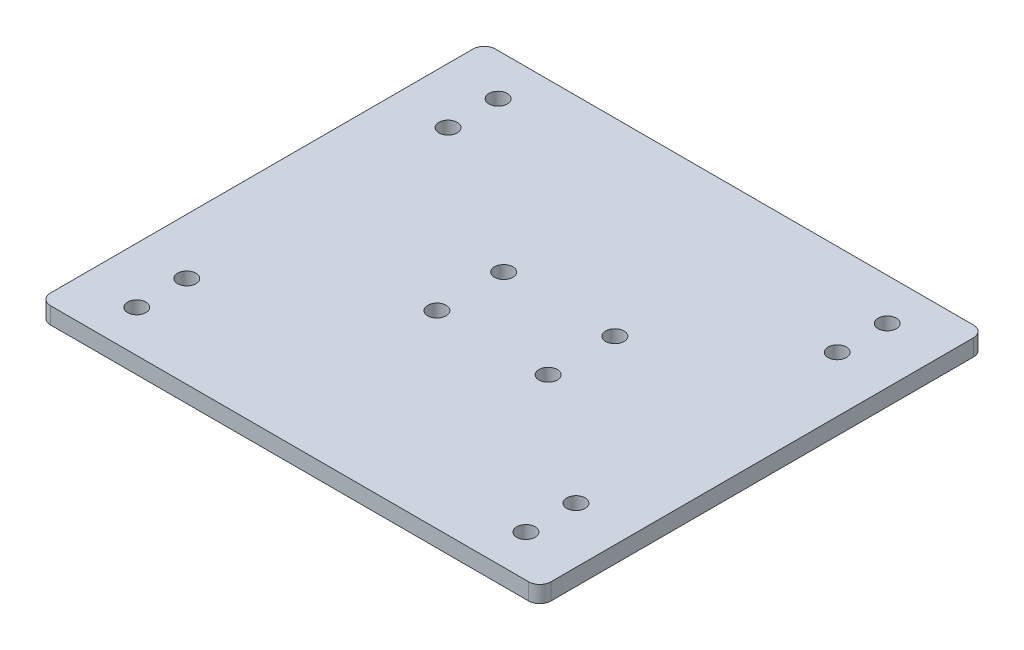
ISO-10303-21;
HEADER;
FILE_DESCRIPTION(('STEP AP214'),'2;1');
FILE_NAME('part.step','',(''),(''),'','','');
FILE_SCHEMA(('AUTOMOTIVE_DESIGN { 1 0 10303 214 1 1 1 1 }'));
ENDSEC;
DATA;
#1=APPLICATION_CONTEXT('core data for automotive mechanical design processes');
#2=APPLICATION_PROTOCOL_DEFINITION('international standard','automotive_design',2000,#1);
#3=PRODUCT_CONTEXT('',#1,'mechanical');
#4=PRODUCT('Part','Part','',(#3));
#5=PRODUCT_RELATED_PRODUCT_CATEGORY('part','',(#4));
#6=PRODUCT_DEFINITION_FORMATION('','',#4);
#7=PRODUCT_DEFINITION_CONTEXT('part definition',#1,'design');
#8=PRODUCT_DEFINITION('design','',#6,#7);
#9=PRODUCT_DEFINITION_SHAPE('','',#8);
#10=(LENGTH_UNIT() NAMED_UNIT(*) SI_UNIT(.MILLI.,.METRE.));
#11=(NAMED_UNIT(*) PLANE_ANGLE_UNIT() SI_UNIT($,.RADIAN.));
#12=(NAMED_UNIT(*) SI_UNIT($,.STERADIAN.) SOLID_ANGLE_UNIT());
#13=UNCERTAINTY_MEASURE_WITH_UNIT(LENGTH_MEASURE(1.E-05),#10,'distance_accuracy_value','');
#14=(GEOMETRIC_REPRESENTATION_CONTEXT(3) GLOBAL_UNCERTAINTY_ASSIGNED_CONTEXT((#13)) GLOBAL_UNIT_ASSIGNED_CONTEXT((#10,
#11,#12)) REPRESENTATION_CONTEXT('',''));
#15=CARTESIAN_POINT('',(0.,0.,0.));
#16=DIRECTION('',(0.,0.,1.));
#17=DIRECTION('',(1.,0.,0.));
#18=AXIS2_PLACEMENT_3D('',#15,#16,#17);
#19=CARTESIAN_POINT('',(45.,1.5,40.));
#20=DIRECTION('',(-1.,0.,0.));
#21=DIRECTION('',(0.,0.,1.));
#22=AXIS2_PLACEMENT_3D('',#19,#20,#21);
#23=PLANE('',#22);
#24=DIRECTION('',(0.,0.,-1.));
#25=VECTOR('',#24,1.);
#26=CARTESIAN_POINT('',(45.,-1.5,40.));
#27=LINE('',#26,#25);
#28=CARTESIAN_POINT('',(45.,-1.5,38.));
#29=VERTEX_POINT('',#28);
#30=CARTESIAN_POINT('',(45.,-1.5,-38.));
#31=VERTEX_POINT('',#30);
#32=EDGE_CURVE('E144',#29,#31,#27,.T.);
#33=ORIENTED_EDGE('',*,*,#32,.T.);
#34=DIRECTION('',(0.,-1.,0.));
#35=VECTOR('',#34,1.);
#36=CARTESIAN_POINT('',(45.,1.5,-38.));
#37=LINE('',#36,#35);
#38=CARTESIAN_POINT('',(45.,1.5,-38.));
#39=VERTEX_POINT('',#38);
#40=EDGE_CURVE('E177',#31,#39,#37,.F.);
#41=ORIENTED_EDGE('',*,*,#40,.T.);
#42=DIRECTION('',(0.,0.,-1.));
#43=VECTOR('',#42,1.);
#44=CARTESIAN_POINT('',(45.,1.5,40.));
#45=LINE('',#44,#43);
#46=CARTESIAN_POINT('',(45.,1.5,38.));
#47=VERTEX_POINT('',#46);
#48=EDGE_CURVE('E141',#47,#39,#45,.T.);
#49=ORIENTED_EDGE('',*,*,#48,.F.);
#50=DIRECTION('',(0.,-1.,0.));
#51=VECTOR('',#50,1.);
#52=CARTESIAN_POINT('',(45.,1.5,38.));
#53=LINE('',#52,#51);
#54=EDGE_CURVE('E172',#47,#29,#53,.T.);
#55=ORIENTED_EDGE('',*,*,#54,.T.);
#56=EDGE_LOOP('',(#33,#41,#49,#55));
#57=FACE_BOUND('',#56,.T.);
#58=ADVANCED_FACE('F42',(#57),#23,.F.);
#59=CARTESIAN_POINT('',(-45.,1.5,-40.));
#60=DIRECTION('',(0.,0.,1.));
#61=DIRECTION('',(1.,0.,0.));
#62=AXIS2_PLACEMENT_3D('',#59,#60,#61);
#63=PLANE('',#62);
#64=DIRECTION('',(-1.,0.,0.));
#65=VECTOR('',#64,1.);
#66=CARTESIAN_POINT('',(-45.,-1.5,-40.));
#67=LINE('',#66,#65);
#68=CARTESIAN_POINT('',(43.,-1.5,-40.));
#69=VERTEX_POINT('',#68);
#70=CARTESIAN_POINT('',(-43.,-1.5,-40.));
#71=VERTEX_POINT('',#70);
#72=EDGE_CURVE('E137',#69,#71,#67,.T.);
#73=ORIENTED_EDGE('',*,*,#72,.T.);
#74=DIRECTION('',(0.,-1.,0.));
#75=VECTOR('',#74,1.);
#76=CARTESIAN_POINT('',(-43.,1.5,-40.));
#77=LINE('',#76,#75);
#78=CARTESIAN_POINT('',(-43.,1.5,-40.));
#79=VERTEX_POINT('',#78);
#80=EDGE_CURVE('E113',#71,#79,#77,.F.);
#81=ORIENTED_EDGE('',*,*,#80,.T.);
#82=DIRECTION('',(-1.,0.,0.));
#83=VECTOR('',#82,1.);
#84=CARTESIAN_POINT('',(-45.,1.5,-40.));
#85=LINE('',#84,#83);
#86=CARTESIAN_POINT('',(43.,1.5,-40.));
#87=VERTEX_POINT('',#86);
#88=EDGE_CURVE('E196',#87,#79,#85,.T.);
#89=ORIENTED_EDGE('',*,*,#88,.F.);
#90=DIRECTION('',(0.,-1.,0.));
#91=VECTOR('',#90,1.);
#92=CARTESIAN_POINT('',(43.,1.5,-40.));
#93=LINE('',#92,#91);
#94=EDGE_CURVE('E123',#87,#69,#93,.T.);
#95=ORIENTED_EDGE('',*,*,#94,.T.);
#96=EDGE_LOOP('',(#73,#81,#89,#95));
#97=FACE_BOUND('',#96,.T.);
#98=ADVANCED_FACE('F346',(#97),#63,.F.);
#99=CARTESIAN_POINT('',(-45.,1.5,40.));
#100=DIRECTION('',(1.,0.,0.));
#101=DIRECTION('',(0.,0.,-1.));
#102=AXIS2_PLACEMENT_3D('',#99,#100,#101);
#103=PLANE('',#102);
#104=DIRECTION('',(0.,0.,1.));
#105=VECTOR('',#104,1.);
#106=CARTESIAN_POINT('',(-45.,1.5,40.));
#107=LINE('',#106,#105);
#108=CARTESIAN_POINT('',(-45.,1.5,-38.));
#109=VERTEX_POINT('',#108);
#110=CARTESIAN_POINT('',(-45.,1.5,38.));
#111=VERTEX_POINT('',#110);
#112=EDGE_CURVE('E128',#109,#111,#107,.T.);
#113=ORIENTED_EDGE('',*,*,#112,.F.);
#114=DIRECTION('',(0.,-1.,0.));
#115=VECTOR('',#114,1.);
#116=CARTESIAN_POINT('',(-45.,1.5,-38.));
#117=LINE('',#116,#115);
#118=CARTESIAN_POINT('',(-45.,-1.5,-38.));
#119=VERTEX_POINT('',#118);
#120=EDGE_CURVE('E111',#109,#119,#117,.T.);
#121=ORIENTED_EDGE('',*,*,#120,.T.);
#122=DIRECTION('',(0.,0.,1.));
#123=VECTOR('',#122,1.);
#124=CARTESIAN_POINT('',(-45.,-1.5,40.));
#125=LINE('',#124,#123);
#126=CARTESIAN_POINT('',(-45.,-1.5,38.));
#127=VERTEX_POINT('',#126);
#128=EDGE_CURVE('E126',#119,#127,#125,.T.);
#129=ORIENTED_EDGE('',*,*,#128,.T.);
#130=DIRECTION('',(0.,-1.,0.));
#131=VECTOR('',#130,1.);
#132=CARTESIAN_POINT('',(-45.,1.5,38.));
#133=LINE('',#132,#131);
#134=EDGE_CURVE('E135',#127,#111,#133,.F.);
#135=ORIENTED_EDGE('',*,*,#134,.T.);
#136=EDGE_LOOP('',(#113,#121,#129,#135));
#137=FACE_BOUND('',#136,.T.);
#138=ADVANCED_FACE('F130',(#137),#103,.F.);
#139=CARTESIAN_POINT('',(-45.,1.5,40.));
#140=DIRECTION('',(0.,0.,-1.));
#141=DIRECTION('',(-1.,0.,0.));
#142=AXIS2_PLACEMENT_3D('',#139,#140,#141);
#143=PLANE('',#142);
#144=DIRECTION('',(1.,0.,0.));
#145=VECTOR('',#144,1.);
#146=CARTESIAN_POINT('',(-45.,-1.5,40.));
#147=LINE('',#146,#145);
#148=CARTESIAN_POINT('',(-43.,-1.5,40.));
#149=VERTEX_POINT('',#148);
#150=CARTESIAN_POINT('',(43.,-1.5,40.));
#151=VERTEX_POINT('',#150);
#152=EDGE_CURVE('E136',#149,#151,#147,.T.);
#153=ORIENTED_EDGE('',*,*,#152,.T.);
#154=DIRECTION('',(0.,-1.,0.));
#155=VECTOR('',#154,1.);
#156=CARTESIAN_POINT('',(43.,1.5,40.));
#157=LINE('',#156,#155);
#158=CARTESIAN_POINT('',(43.,1.5,40.));
#159=VERTEX_POINT('',#158);
#160=EDGE_CURVE('E11',#151,#159,#157,.F.);
#161=ORIENTED_EDGE('',*,*,#160,.T.);
#162=DIRECTION('',(1.,0.,0.));
#163=VECTOR('',#162,1.);
#164=CARTESIAN_POINT('',(-45.,1.5,40.));
#165=LINE('',#164,#163);
#166=CARTESIAN_POINT('',(-43.,1.5,40.));
#167=VERTEX_POINT('',#166);
#168=EDGE_CURVE('E147',#167,#159,#165,.T.);
#169=ORIENTED_EDGE('',*,*,#168,.F.);
#170=DIRECTION('',(0.,-1.,0.));
#171=VECTOR('',#170,1.);
#172=CARTESIAN_POINT('',(-43.,1.5,40.));
#173=LINE('',#172,#171);
#174=EDGE_CURVE('E52',#167,#149,#173,.T.);
#175=ORIENTED_EDGE('',*,*,#174,.T.);
#176=EDGE_LOOP('',(#153,#161,#169,#175));
#177=FACE_BOUND('',#176,.T.);
#178=ADVANCED_FACE('F184',(#177),#143,.F.);
#179=CARTESIAN_POINT('',(0.,1.5,0.));
#180=DIRECTION('',(0.,-1.,0.));
#181=DIRECTION('',(0.,0.,-1.));
#182=AXIS2_PLACEMENT_3D('',#179,#180,#181);
#183=PLANE('',#182);
#184=CARTESIAN_POINT('',(-35.,1.5,32.5));
#185=DIRECTION('',(0.,-1.,0.));
#186=DIRECTION('',(0.,0.,1.));
#187=AXIS2_PLACEMENT_3D('',#184,#185,#186);
#188=CIRCLE('',#187,1.65);
#189=CARTESIAN_POINT('',(-35.,1.5,34.15));
#190=VERTEX_POINT('',#189);
#191=EDGE_CURVE('E291',#190,#190,#188,.T.);
#192=ORIENTED_EDGE('',*,*,#191,.T.);
#193=EDGE_LOOP('',(#192));
#194=FACE_BOUND('',#193,.T.);
#195=CARTESIAN_POINT('',(-35.,1.5,-32.5));
#196=DIRECTION('',(0.,-1.,0.));
#197=DIRECTION('',(0.,0.,1.));
#198=AXIS2_PLACEMENT_3D('',#195,#196,#197);
#199=CIRCLE('',#198,1.65);
#200=CARTESIAN_POINT('',(-35.,1.5,-30.85));
#201=VERTEX_POINT('',#200);
#202=EDGE_CURVE('E283',#201,#201,#199,.T.);
#203=ORIENTED_EDGE('',*,*,#202,.T.);
#204=EDGE_LOOP('',(#203));
#205=FACE_BOUND('',#204,.T.);
#206=CARTESIAN_POINT('',(-35.,1.5,-23.5));
#207=DIRECTION('',(0.,-1.,0.));
#208=DIRECTION('',(0.,0.,1.));
#209=AXIS2_PLACEMENT_3D('',#206,#207,#208);
#210=CIRCLE('',#209,1.65);
#211=CARTESIAN_POINT('',(-35.,1.5,-21.85));
#212=VERTEX_POINT('',#211);
#213=EDGE_CURVE('E297',#212,#212,#210,.T.);
#214=ORIENTED_EDGE('',*,*,#213,.T.);
#215=EDGE_LOOP('',(#214));
#216=FACE_BOUND('',#215,.T.);
#217=CARTESIAN_POINT('',(-35.,1.5,23.5));
#218=DIRECTION('',(0.,-1.,0.));
#219=DIRECTION('',(0.,0.,1.));
#220=AXIS2_PLACEMENT_3D('',#217,#218,#219);
#221=CIRCLE('',#220,1.65);
#222=CARTESIAN_POINT('',(-35.,1.5,25.15));
#223=VERTEX_POINT('',#222);
#224=EDGE_CURVE('E277',#223,#223,#221,.T.);
#225=ORIENTED_EDGE('',*,*,#224,.T.);
#226=EDGE_LOOP('',(#225));
#227=FACE_BOUND('',#226,.T.);
#228=CARTESIAN_POINT('',(35.,1.5,32.5));
#229=DIRECTION('',(0.,1.,0.));
#230=DIRECTION('',(0.,0.,1.));
#231=AXIS2_PLACEMENT_3D('',#228,#229,#230);
#232=CIRCLE('',#231,1.65);
#233=CARTESIAN_POINT('',(35.,1.5,34.15));
#234=VERTEX_POINT('',#233);
#235=EDGE_CURVE('E246',#234,#234,#232,.T.);
#236=ORIENTED_EDGE('',*,*,#235,.F.);
#237=EDGE_LOOP('',(#236));
#238=FACE_BOUND('',#237,.T.);
#239=CARTESIAN_POINT('',(35.,1.5,-32.5));
#240=DIRECTION('',(0.,1.,0.));
#241=DIRECTION('',(0.,0.,1.));
#242=AXIS2_PLACEMENT_3D('',#239,#240,#241);
#243=CIRCLE('',#242,1.65);
#244=CARTESIAN_POINT('',(35.,1.5,-30.85));
#245=VERTEX_POINT('',#244);
#246=EDGE_CURVE('E258',#245,#245,#243,.T.);
#247=ORIENTED_EDGE('',*,*,#246,.F.);
#248=EDGE_LOOP('',(#247));
#249=FACE_BOUND('',#248,.T.);
#250=CARTESIAN_POINT('',(35.,1.5,-23.5));
#251=DIRECTION('',(0.,1.,0.));
#252=DIRECTION('',(0.,0.,1.));
#253=AXIS2_PLACEMENT_3D('',#250,#251,#252);
#254=CIRCLE('',#253,1.65);
#255=CARTESIAN_POINT('',(35.,1.5,-21.85));
#256=VERTEX_POINT('',#255);
#257=EDGE_CURVE('E260',#256,#256,#254,.T.);
#258=ORIENTED_EDGE('',*,*,#257,.F.);
#259=EDGE_LOOP('',(#258));
#260=FACE_BOUND('',#259,.T.);
#261=CARTESIAN_POINT('',(35.,1.5,23.5));
#262=DIRECTION('',(0.,1.,0.));
#263=DIRECTION('',(0.,0.,1.));
#264=AXIS2_PLACEMENT_3D('',#261,#262,#263);
#265=CIRCLE('',#264,1.65);
#266=CARTESIAN_POINT('',(35.,1.5,25.15));
#267=VERTEX_POINT('',#266);
#268=EDGE_CURVE('E243',#267,#267,#265,.T.);
#269=ORIENTED_EDGE('',*,*,#268,.F.);
#270=EDGE_LOOP('',(#269));
#271=FACE_BOUND('',#270,.T.);
#272=CARTESIAN_POINT('',(12.5,1.5,6.));
#273=DIRECTION('',(0.,1.,0.));
#274=DIRECTION('',(0.,0.,1.));
#275=AXIS2_PLACEMENT_3D('',#272,#273,#274);
#276=CIRCLE('',#275,1.65);
#277=CARTESIAN_POINT('',(12.5,1.5,7.65));
#278=VERTEX_POINT('',#277);
#279=EDGE_CURVE('E221',#278,#278,#276,.T.);
#280=ORIENTED_EDGE('',*,*,#279,.F.);
#281=EDGE_LOOP('',(#280));
#282=FACE_BOUND('',#281,.T.);
#283=CARTESIAN_POINT('',(-7.5,1.5,6.));
#284=DIRECTION('',(0.,1.,0.));
#285=DIRECTION('',(0.,0.,1.));
#286=AXIS2_PLACEMENT_3D('',#283,#284,#285);
#287=CIRCLE('',#286,1.65);
#288=CARTESIAN_POINT('',(-7.5,1.5,7.65));
#289=VERTEX_POINT('',#288);
#290=EDGE_CURVE('E231',#289,#289,#287,.T.);
#291=ORIENTED_EDGE('',*,*,#290,.F.);
#292=EDGE_LOOP('',(#291));
#293=FACE_BOUND('',#292,.T.);
#294=CARTESIAN_POINT('',(-7.5,1.5,-6.));
#295=DIRECTION('',(0.,1.,0.));
#296=DIRECTION('',(0.,0.,1.));
#297=AXIS2_PLACEMENT_3D('',#294,#295,#296);
#298=CIRCLE('',#297,1.65);
#299=CARTESIAN_POINT('',(-7.5,1.5,-4.35));
#300=VERTEX_POINT('',#299);
#301=EDGE_CURVE('E217',#300,#300,#298,.T.);
#302=ORIENTED_EDGE('',*,*,#301,.F.);
#303=EDGE_LOOP('',(#302));
#304=FACE_BOUND('',#303,.T.);
#305=CARTESIAN_POINT('',(12.5,1.5,-6.));
#306=DIRECTION('',(0.,1.,0.));
#307=DIRECTION('',(0.,0.,1.));
#308=AXIS2_PLACEMENT_3D('',#305,#306,#307);
#309=CIRCLE('',#308,1.65);
#310=CARTESIAN_POINT('',(12.5,1.5,-4.35));
#311=VERTEX_POINT('',#310);
#312=EDGE_CURVE('E204',#311,#311,#309,.T.);
#313=ORIENTED_EDGE('',*,*,#312,.F.);
#314=EDGE_LOOP('',(#313));
#315=FACE_BOUND('',#314,.T.);
#316=ORIENTED_EDGE('',*,*,#88,.T.);
#317=CARTESIAN_POINT('',(-43.,1.5,-38.));
#318=DIRECTION('',(0.,-1.,0.));
#319=DIRECTION('',(0.,0.,-1.));
#320=AXIS2_PLACEMENT_3D('',#317,#318,#319);
#321=CIRCLE('',#320,2.);
#322=EDGE_CURVE('E171',#79,#109,#321,.F.);
#323=ORIENTED_EDGE('',*,*,#322,.T.);
#324=ORIENTED_EDGE('',*,*,#112,.T.);
#325=CARTESIAN_POINT('',(-43.,1.5,38.));
#326=DIRECTION('',(0.,-1.,0.));
#327=DIRECTION('',(0.,0.,-1.));
#328=AXIS2_PLACEMENT_3D('',#325,#326,#327);
#329=CIRCLE('',#328,2.);
#330=EDGE_CURVE('E62',#111,#167,#329,.F.);
#331=ORIENTED_EDGE('',*,*,#330,.T.);
#332=ORIENTED_EDGE('',*,*,#168,.T.);
#333=CARTESIAN_POINT('',(43.,1.5,38.));
#334=DIRECTION('',(0.,-1.,0.));
#335=DIRECTION('',(0.,0.,-1.));
#336=AXIS2_PLACEMENT_3D('',#333,#334,#335);
#337=CIRCLE('',#336,2.);
#338=EDGE_CURVE('E167',#159,#47,#337,.F.);
#339=ORIENTED_EDGE('',*,*,#338,.T.);
#340=ORIENTED_EDGE('',*,*,#48,.T.);
#341=CARTESIAN_POINT('',(43.,1.5,-38.));
#342=DIRECTION('',(0.,-1.,0.));
#343=DIRECTION('',(0.,0.,-1.));
#344=AXIS2_PLACEMENT_3D('',#341,#342,#343);
#345=CIRCLE('',#344,2.);
#346=EDGE_CURVE('E166',#39,#87,#345,.F.);
#347=ORIENTED_EDGE('',*,*,#346,.T.);
#348=EDGE_LOOP('',(#316,#323,#324,#331,#332,#339,#340,#347));
#349=FACE_BOUND('',#348,.T.);
#350=ADVANCED_FACE('F314',(#194,#205,#216,#227,#238,#249,#260,#271,#282,#293,#304,#315,#349),
#183,.F.);
#351=CARTESIAN_POINT('',(0.,-1.5,0.));
#352=DIRECTION('',(0.,-1.,0.));
#353=DIRECTION('',(0.,0.,-1.));
#354=AXIS2_PLACEMENT_3D('',#351,#352,#353);
#355=PLANE('',#354);
#356=CARTESIAN_POINT('',(-35.,-1.5,32.5));
#357=DIRECTION('',(0.,-1.,0.));
#358=DIRECTION('',(0.,0.,1.));
#359=AXIS2_PLACEMENT_3D('',#356,#357,#358);
#360=CIRCLE('',#359,1.65);
#361=CARTESIAN_POINT('',(-35.,-1.5,34.15));
#362=VERTEX_POINT('',#361);
#363=EDGE_CURVE('E278',#362,#362,#360,.T.);
#364=ORIENTED_EDGE('',*,*,#363,.F.);
#365=EDGE_LOOP('',(#364));
#366=FACE_BOUND('',#365,.T.);
#367=CARTESIAN_POINT('',(-35.,-1.5,-32.5));
#368=DIRECTION('',(0.,-1.,0.));
#369=DIRECTION('',(0.,0.,1.));
#370=AXIS2_PLACEMENT_3D('',#367,#368,#369);
#371=CIRCLE('',#370,1.65);
#372=CARTESIAN_POINT('',(-35.,-1.5,-30.85));
#373=VERTEX_POINT('',#372);
#374=EDGE_CURVE('E286',#373,#373,#371,.T.);
#375=ORIENTED_EDGE('',*,*,#374,.F.);
#376=EDGE_LOOP('',(#375));
#377=FACE_BOUND('',#376,.T.);
#378=CARTESIAN_POINT('',(-35.,-1.5,-23.5));
#379=DIRECTION('',(0.,-1.,0.));
#380=DIRECTION('',(0.,0.,1.));
#381=AXIS2_PLACEMENT_3D('',#378,#379,#380);
#382=CIRCLE('',#381,1.65);
#383=CARTESIAN_POINT('',(-35.,-1.5,-21.85));
#384=VERTEX_POINT('',#383);
#385=EDGE_CURVE('E287',#384,#384,#382,.T.);
#386=ORIENTED_EDGE('',*,*,#385,.F.);
#387=EDGE_LOOP('',(#386));
#388=FACE_BOUND('',#387,.T.);
#389=CARTESIAN_POINT('',(-35.,-1.5,23.5));
#390=DIRECTION('',(0.,-1.,0.));
#391=DIRECTION('',(0.,0.,1.));
#392=AXIS2_PLACEMENT_3D('',#389,#390,#391);
#393=CIRCLE('',#392,1.65);
#394=CARTESIAN_POINT('',(-35.,-1.5,25.15));
#395=VERTEX_POINT('',#394);
#396=EDGE_CURVE('E275',#395,#395,#393,.T.);
#397=ORIENTED_EDGE('',*,*,#396,.F.);
#398=EDGE_LOOP('',(#397));
#399=FACE_BOUND('',#398,.T.);
#400=CARTESIAN_POINT('',(35.,-1.5,32.5));
#401=DIRECTION('',(0.,1.,0.));
#402=DIRECTION('',(0.,0.,1.));
#403=AXIS2_PLACEMENT_3D('',#400,#401,#402);
#404=CIRCLE('',#403,1.65);
#405=CARTESIAN_POINT('',(35.,-1.5,34.15));
#406=VERTEX_POINT('',#405);
#407=EDGE_CURVE('E261',#406,#406,#404,.T.);
#408=ORIENTED_EDGE('',*,*,#407,.T.);
#409=EDGE_LOOP('',(#408));
#410=FACE_BOUND('',#409,.T.);
#411=CARTESIAN_POINT('',(35.,-1.5,-32.5));
#412=DIRECTION('',(0.,1.,0.));
#413=DIRECTION('',(0.,0.,1.));
#414=AXIS2_PLACEMENT_3D('',#411,#412,#413);
#415=CIRCLE('',#414,1.65);
#416=CARTESIAN_POINT('',(35.,-1.5,-30.85));
#417=VERTEX_POINT('',#416);
#418=EDGE_CURVE('E252',#417,#417,#415,.T.);
#419=ORIENTED_EDGE('',*,*,#418,.T.);
#420=EDGE_LOOP('',(#419));
#421=FACE_BOUND('',#420,.T.);
#422=CARTESIAN_POINT('',(35.,-1.5,-23.5));
#423=DIRECTION('',(0.,1.,0.));
#424=DIRECTION('',(0.,0.,1.));
#425=AXIS2_PLACEMENT_3D('',#422,#423,#424);
#426=CIRCLE('',#425,1.65);
#427=CARTESIAN_POINT('',(35.,-1.5,-21.85));
#428=VERTEX_POINT('',#427);
#429=EDGE_CURVE('E268',#428,#428,#426,.T.);
#430=ORIENTED_EDGE('',*,*,#429,.T.);
#431=EDGE_LOOP('',(#430));
#432=FACE_BOUND('',#431,.T.);
#433=CARTESIAN_POINT('',(35.,-1.5,23.5));
#434=DIRECTION('',(0.,1.,0.));
#435=DIRECTION('',(0.,0.,1.));
#436=AXIS2_PLACEMENT_3D('',#433,#434,#435);
#437=CIRCLE('',#436,1.65);
#438=CARTESIAN_POINT('',(35.,-1.5,25.15));
#439=VERTEX_POINT('',#438);
#440=EDGE_CURVE('E223',#439,#439,#437,.T.);
#441=ORIENTED_EDGE('',*,*,#440,.T.);
#442=EDGE_LOOP('',(#441));
#443=FACE_BOUND('',#442,.T.);
#444=CARTESIAN_POINT('',(12.5,-1.5,6.));
#445=DIRECTION('',(0.,1.,0.));
#446=DIRECTION('',(0.,0.,1.));
#447=AXIS2_PLACEMENT_3D('',#444,#445,#446);
#448=CIRCLE('',#447,1.65);
#449=CARTESIAN_POINT('',(12.5,-1.5,7.65));
#450=VERTEX_POINT('',#449);
#451=EDGE_CURVE('E219',#450,#450,#448,.T.);
#452=ORIENTED_EDGE('',*,*,#451,.T.);
#453=EDGE_LOOP('',(#452));
#454=FACE_BOUND('',#453,.T.);
#455=CARTESIAN_POINT('',(-7.5,-1.5,6.));
#456=DIRECTION('',(0.,1.,0.));
#457=DIRECTION('',(0.,0.,1.));
#458=AXIS2_PLACEMENT_3D('',#455,#456,#457);
#459=CIRCLE('',#458,1.65);
#460=CARTESIAN_POINT('',(-7.5,-1.5,7.65));
#461=VERTEX_POINT('',#460);
#462=EDGE_CURVE('E228',#461,#461,#459,.T.);
#463=ORIENTED_EDGE('',*,*,#462,.T.);
#464=EDGE_LOOP('',(#463));
#465=FACE_BOUND('',#464,.T.);
#466=CARTESIAN_POINT('',(-7.5,-1.5,-6.));
#467=DIRECTION('',(0.,1.,0.));
#468=DIRECTION('',(0.,0.,1.));
#469=AXIS2_PLACEMENT_3D('',#466,#467,#468);
#470=CIRCLE('',#469,1.65);
#471=CARTESIAN_POINT('',(-7.5,-1.5,-4.35));
#472=VERTEX_POINT('',#471);
#473=EDGE_CURVE('E240',#472,#472,#470,.T.);
#474=ORIENTED_EDGE('',*,*,#473,.T.);
#475=EDGE_LOOP('',(#474));
#476=FACE_BOUND('',#475,.T.);
#477=CARTESIAN_POINT('',(12.5,-1.5,-6.));
#478=DIRECTION('',(0.,1.,0.));
#479=DIRECTION('',(0.,0.,1.));
#480=AXIS2_PLACEMENT_3D('',#477,#478,#479);
#481=CIRCLE('',#480,1.65);
#482=CARTESIAN_POINT('',(12.5,-1.5,-4.35));
#483=VERTEX_POINT('',#482);
#484=EDGE_CURVE('E211',#483,#483,#481,.T.);
#485=ORIENTED_EDGE('',*,*,#484,.T.);
#486=EDGE_LOOP('',(#485));
#487=FACE_BOUND('',#486,.T.);
#488=ORIENTED_EDGE('',*,*,#128,.F.);
#489=CARTESIAN_POINT('',(-43.,-1.5,-38.));
#490=DIRECTION('',(0.,-1.,0.));
#491=DIRECTION('',(0.,0.,-1.));
#492=AXIS2_PLACEMENT_3D('',#489,#490,#491);
#493=CIRCLE('',#492,2.);
#494=EDGE_CURVE('E109',#119,#71,#493,.T.);
#495=ORIENTED_EDGE('',*,*,#494,.T.);
#496=ORIENTED_EDGE('',*,*,#72,.F.);
#497=CARTESIAN_POINT('',(43.,-1.5,-38.));
#498=DIRECTION('',(0.,-1.,0.));
#499=DIRECTION('',(0.,0.,-1.));
#500=AXIS2_PLACEMENT_3D('',#497,#498,#499);
#501=CIRCLE('',#500,2.);
#502=EDGE_CURVE('E125',#69,#31,#501,.T.);
#503=ORIENTED_EDGE('',*,*,#502,.T.);
#504=ORIENTED_EDGE('',*,*,#32,.F.);
#505=CARTESIAN_POINT('',(43.,-1.5,38.));
#506=DIRECTION('',(0.,-1.,0.));
#507=DIRECTION('',(0.,0.,-1.));
#508=AXIS2_PLACEMENT_3D('',#505,#506,#507);
#509=CIRCLE('',#508,2.);
#510=EDGE_CURVE('E152',#29,#151,#509,.T.);
#511=ORIENTED_EDGE('',*,*,#510,.T.);
#512=ORIENTED_EDGE('',*,*,#152,.F.);
#513=CARTESIAN_POINT('',(-43.,-1.5,38.));
#514=DIRECTION('',(0.,-1.,0.));
#515=DIRECTION('',(0.,0.,-1.));
#516=AXIS2_PLACEMENT_3D('',#513,#514,#515);
#517=CIRCLE('',#516,2.);
#518=EDGE_CURVE('E131',#149,#127,#517,.T.);
#519=ORIENTED_EDGE('',*,*,#518,.T.);
#520=EDGE_LOOP('',(#488,#495,#496,#503,#504,#511,#512,#519));
#521=FACE_BOUND('',#520,.T.);
#522=ADVANCED_FACE('F132',(#366,#377,#388,#399,#410,#421,#432,#443,#454,#465,#476,#487,#521),
#355,.T.);
#523=CARTESIAN_POINT('',(12.5,-1.5,-6.));
#524=DIRECTION('',(0.,1.,0.));
#525=DIRECTION('',(0.,0.,1.));
#526=AXIS2_PLACEMENT_3D('',#523,#524,#525);
#527=CYLINDRICAL_SURFACE('',#526,1.65);
#528=ORIENTED_EDGE('',*,*,#484,.F.);
#529=EDGE_LOOP('',(#528));
#530=FACE_BOUND('',#529,.T.);
#531=ORIENTED_EDGE('',*,*,#312,.T.);
#532=EDGE_LOOP('',(#531));
#533=FACE_BOUND('',#532,.T.);
#534=ADVANCED_FACE('F311',(#530,#533),#527,.F.);
#535=CARTESIAN_POINT('',(-7.5,-1.5,-6.));
#536=DIRECTION('',(0.,1.,0.));
#537=DIRECTION('',(0.,0.,1.));
#538=AXIS2_PLACEMENT_3D('',#535,#536,#537);
#539=CYLINDRICAL_SURFACE('',#538,1.65);
#540=ORIENTED_EDGE('',*,*,#473,.F.);
#541=EDGE_LOOP('',(#540));
#542=FACE_BOUND('',#541,.T.);
#543=ORIENTED_EDGE('',*,*,#301,.T.);
#544=EDGE_LOOP('',(#543));
#545=FACE_BOUND('',#544,.T.);
#546=ADVANCED_FACE('F334',(#542,#545),#539,.F.);
#547=CARTESIAN_POINT('',(-7.5,-1.5,6.));
#548=DIRECTION('',(0.,1.,0.));
#549=DIRECTION('',(0.,0.,1.));
#550=AXIS2_PLACEMENT_3D('',#547,#548,#549);
#551=CYLINDRICAL_SURFACE('',#550,1.65);
#552=ORIENTED_EDGE('',*,*,#462,.F.);
#553=EDGE_LOOP('',(#552));
#554=FACE_BOUND('',#553,.T.);
#555=ORIENTED_EDGE('',*,*,#290,.T.);
#556=EDGE_LOOP('',(#555));
#557=FACE_BOUND('',#556,.T.);
#558=ADVANCED_FACE('F339',(#554,#557),#551,.F.);
#559=CARTESIAN_POINT('',(12.5,-1.5,6.));
#560=DIRECTION('',(0.,1.,0.));
#561=DIRECTION('',(0.,0.,1.));
#562=AXIS2_PLACEMENT_3D('',#559,#560,#561);
#563=CYLINDRICAL_SURFACE('',#562,1.65);
#564=ORIENTED_EDGE('',*,*,#451,.F.);
#565=EDGE_LOOP('',(#564));
#566=FACE_BOUND('',#565,.T.);
#567=ORIENTED_EDGE('',*,*,#279,.T.);
#568=EDGE_LOOP('',(#567));
#569=FACE_BOUND('',#568,.T.);
#570=ADVANCED_FACE('F360',(#566,#569),#563,.F.);
#571=CARTESIAN_POINT('',(-43.,1.5,-38.));
#572=DIRECTION('',(0.,-1.,0.));
#573=DIRECTION('',(0.,0.,-1.));
#574=AXIS2_PLACEMENT_3D('',#571,#572,#573);
#575=CYLINDRICAL_SURFACE('',#574,2.);
#576=ORIENTED_EDGE('',*,*,#322,.F.);
#577=ORIENTED_EDGE('',*,*,#80,.F.);
#578=ORIENTED_EDGE('',*,*,#494,.F.);
#579=ORIENTED_EDGE('',*,*,#120,.F.);
#580=EDGE_LOOP('',(#576,#577,#578,#579));
#581=FACE_BOUND('',#580,.T.);
#582=ADVANCED_FACE('F114',(#581),#575,.T.);
#583=CARTESIAN_POINT('',(43.,1.5,-38.));
#584=DIRECTION('',(0.,-1.,0.));
#585=DIRECTION('',(0.,0.,-1.));
#586=AXIS2_PLACEMENT_3D('',#583,#584,#585);
#587=CYLINDRICAL_SURFACE('',#586,2.);
#588=ORIENTED_EDGE('',*,*,#346,.F.);
#589=ORIENTED_EDGE('',*,*,#40,.F.);
#590=ORIENTED_EDGE('',*,*,#502,.F.);
#591=ORIENTED_EDGE('',*,*,#94,.F.);
#592=EDGE_LOOP('',(#588,#589,#590,#591));
#593=FACE_BOUND('',#592,.T.);
#594=ADVANCED_FACE('F348',(#593),#587,.T.);
#595=CARTESIAN_POINT('',(43.,1.5,38.));
#596=DIRECTION('',(0.,-1.,0.));
#597=DIRECTION('',(0.,0.,-1.));
#598=AXIS2_PLACEMENT_3D('',#595,#596,#597);
#599=CYLINDRICAL_SURFACE('',#598,2.);
#600=ORIENTED_EDGE('',*,*,#338,.F.);
#601=ORIENTED_EDGE('',*,*,#160,.F.);
#602=ORIENTED_EDGE('',*,*,#510,.F.);
#603=ORIENTED_EDGE('',*,*,#54,.F.);
#604=EDGE_LOOP('',(#600,#601,#602,#603));
#605=FACE_BOUND('',#604,.T.);
#606=ADVANCED_FACE('F193',(#605),#599,.T.);
#607=CARTESIAN_POINT('',(-43.,1.5,38.));
#608=DIRECTION('',(0.,-1.,0.));
#609=DIRECTION('',(0.,0.,-1.));
#610=AXIS2_PLACEMENT_3D('',#607,#608,#609);
#611=CYLINDRICAL_SURFACE('',#610,2.);
#612=ORIENTED_EDGE('',*,*,#330,.F.);
#613=ORIENTED_EDGE('',*,*,#134,.F.);
#614=ORIENTED_EDGE('',*,*,#518,.F.);
#615=ORIENTED_EDGE('',*,*,#174,.F.);
#616=EDGE_LOOP('',(#612,#613,#614,#615));
#617=FACE_BOUND('',#616,.T.);
#618=ADVANCED_FACE('F46',(#617),#611,.T.);
#619=CARTESIAN_POINT('',(35.,-1.5,23.5));
#620=DIRECTION('',(0.,1.,0.));
#621=DIRECTION('',(0.,0.,1.));
#622=AXIS2_PLACEMENT_3D('',#619,#620,#621);
#623=CYLINDRICAL_SURFACE('',#622,1.65);
#624=ORIENTED_EDGE('',*,*,#440,.F.);
#625=EDGE_LOOP('',(#624));
#626=FACE_BOUND('',#625,.T.);
#627=ORIENTED_EDGE('',*,*,#268,.T.);
#628=EDGE_LOOP('',(#627));
#629=FACE_BOUND('',#628,.T.);
#630=ADVANCED_FACE('F377',(#626,#629),#623,.F.);
#631=CARTESIAN_POINT('',(35.,-1.5,-23.5));
#632=DIRECTION('',(0.,1.,0.));
#633=DIRECTION('',(0.,0.,1.));
#634=AXIS2_PLACEMENT_3D('',#631,#632,#633);
#635=CYLINDRICAL_SURFACE('',#634,1.65);
#636=ORIENTED_EDGE('',*,*,#429,.F.);
#637=EDGE_LOOP('',(#636));
#638=FACE_BOUND('',#637,.T.);
#639=ORIENTED_EDGE('',*,*,#257,.T.);
#640=EDGE_LOOP('',(#639));
#641=FACE_BOUND('',#640,.T.);
#642=ADVANCED_FACE('F385',(#638,#641),#635,.F.);
#643=CARTESIAN_POINT('',(35.,-1.5,-32.5));
#644=DIRECTION('',(0.,1.,0.));
#645=DIRECTION('',(0.,0.,1.));
#646=AXIS2_PLACEMENT_3D('',#643,#644,#645);
#647=CYLINDRICAL_SURFACE('',#646,1.65);
#648=ORIENTED_EDGE('',*,*,#418,.F.);
#649=EDGE_LOOP('',(#648));
#650=FACE_BOUND('',#649,.T.);
#651=ORIENTED_EDGE('',*,*,#246,.T.);
#652=EDGE_LOOP('',(#651));
#653=FACE_BOUND('',#652,.T.);
#654=ADVANCED_FACE('F383',(#650,#653),#647,.F.);
#655=CARTESIAN_POINT('',(35.,-1.5,32.5));
#656=DIRECTION('',(0.,1.,0.));
#657=DIRECTION('',(0.,0.,1.));
#658=AXIS2_PLACEMENT_3D('',#655,#656,#657);
#659=CYLINDRICAL_SURFACE('',#658,1.65);
#660=ORIENTED_EDGE('',*,*,#407,.F.);
#661=EDGE_LOOP('',(#660));
#662=FACE_BOUND('',#661,.T.);
#663=ORIENTED_EDGE('',*,*,#235,.T.);
#664=EDGE_LOOP('',(#663));
#665=FACE_BOUND('',#664,.T.);
#666=ADVANCED_FACE('F390',(#662,#665),#659,.F.);
#667=CARTESIAN_POINT('',(-35.,-1.5,23.5));
#668=DIRECTION('',(0.,1.,0.));
#669=DIRECTION('',(0.,0.,1.));
#670=AXIS2_PLACEMENT_3D('',#667,#668,#669);
#671=CYLINDRICAL_SURFACE('',#670,1.65);
#672=ORIENTED_EDGE('',*,*,#396,.T.);
#673=EDGE_LOOP('',(#672));
#674=FACE_BOUND('',#673,.T.);
#675=ORIENTED_EDGE('',*,*,#224,.F.);
#676=EDGE_LOOP('',(#675));
#677=FACE_BOUND('',#676,.T.);
#678=ADVANCED_FACE('F394',(#674,#677),#671,.F.);
#679=CARTESIAN_POINT('',(-35.,-1.5,-23.5));
#680=DIRECTION('',(0.,1.,0.));
#681=DIRECTION('',(0.,0.,1.));
#682=AXIS2_PLACEMENT_3D('',#679,#680,#681);
#683=CYLINDRICAL_SURFACE('',#682,1.65);
#684=ORIENTED_EDGE('',*,*,#385,.T.);
#685=EDGE_LOOP('',(#684));
#686=FACE_BOUND('',#685,.T.);
#687=ORIENTED_EDGE('',*,*,#213,.F.);
#688=EDGE_LOOP('',(#687));
#689=FACE_BOUND('',#688,.T.);
#690=ADVANCED_FACE('F306',(#686,#689),#683,.F.);
#691=CARTESIAN_POINT('',(-35.,-1.5,-32.5));
#692=DIRECTION('',(0.,1.,0.));
#693=DIRECTION('',(0.,0.,1.));
#694=AXIS2_PLACEMENT_3D('',#691,#692,#693);
#695=CYLINDRICAL_SURFACE('',#694,1.65);
#696=ORIENTED_EDGE('',*,*,#374,.T.);
#697=EDGE_LOOP('',(#696));
#698=FACE_BOUND('',#697,.T.);
#699=ORIENTED_EDGE('',*,*,#202,.F.);
#700=EDGE_LOOP('',(#699));
#701=FACE_BOUND('',#700,.T.);
#702=ADVANCED_FACE('F397',(#698,#701),#695,.F.);
#703=CARTESIAN_POINT('',(-35.,-1.5,32.5));
#704=DIRECTION('',(0.,1.,0.));
#705=DIRECTION('',(0.,0.,1.));
#706=AXIS2_PLACEMENT_3D('',#703,#704,#705);
#707=CYLINDRICAL_SURFACE('',#706,1.65);
#708=ORIENTED_EDGE('',*,*,#363,.T.);
#709=EDGE_LOOP('',(#708));
#710=FACE_BOUND('',#709,.T.);
#711=ORIENTED_EDGE('',*,*,#191,.F.);
#712=EDGE_LOOP('',(#711));
#713=FACE_BOUND('',#712,.T.);
#714=ADVANCED_FACE('F405',(#710,#713),#707,.F.);
#715=CLOSED_SHELL('',(#58,#98,#138,#178,#350,#522,#534,#546,#558,#570,#582,#594,#606,#618,#630,
#642,#654,#666,#678,#690,#702,#714));
#716=MANIFOLD_SOLID_BREP('B2',#715);
#717=ADVANCED_BREP_SHAPE_REPRESENTATION('',(#18,#716),#14);
#718=SHAPE_DEFINITION_REPRESENTATION(#9,#717);
ENDSEC;
END-ISO-10303-21;
